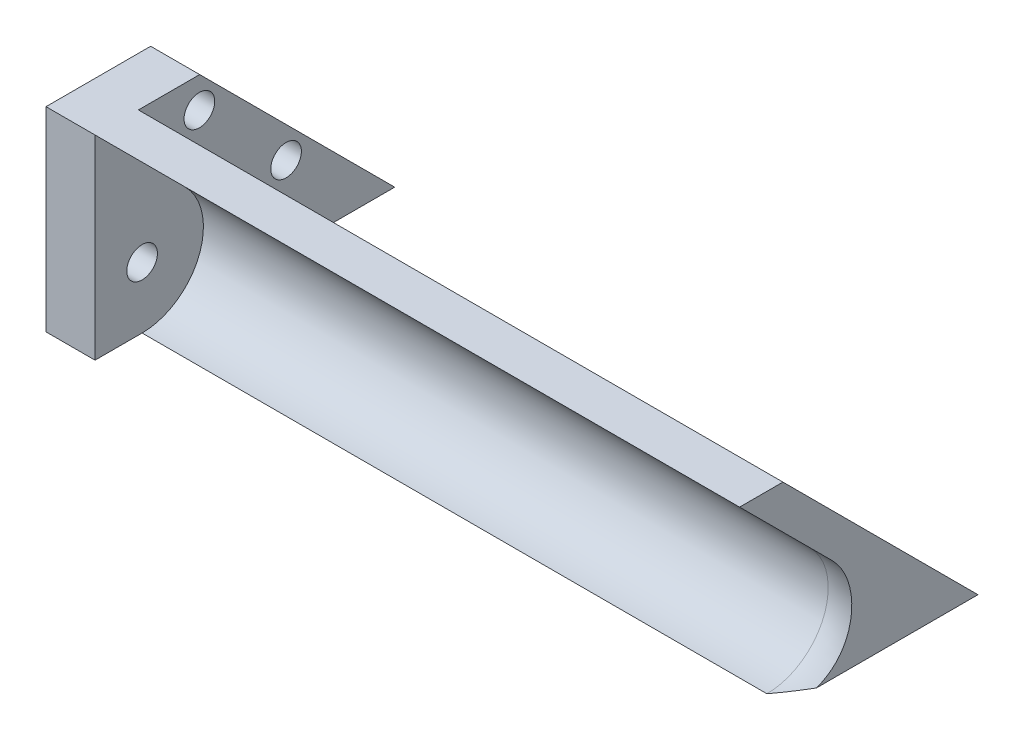
ISO-10303-21;
HEADER;
FILE_DESCRIPTION(('STEP AP214'),'2;1');
FILE_NAME('part.step','',(''),(''),'','','');
FILE_SCHEMA(('AUTOMOTIVE_DESIGN { 1 0 10303 214 1 1 1 1 }'));
ENDSEC;
DATA;
#1=APPLICATION_CONTEXT('core data for automotive mechanical design processes');
#2=APPLICATION_PROTOCOL_DEFINITION('international standard','automotive_design',2000,#1);
#3=PRODUCT_CONTEXT('',#1,'mechanical');
#4=PRODUCT('Part','Part','',(#3));
#5=PRODUCT_RELATED_PRODUCT_CATEGORY('part','',(#4));
#6=PRODUCT_DEFINITION_FORMATION('','',#4);
#7=PRODUCT_DEFINITION_CONTEXT('part definition',#1,'design');
#8=PRODUCT_DEFINITION('design','',#6,#7);
#9=PRODUCT_DEFINITION_SHAPE('','',#8);
#10=(LENGTH_UNIT() NAMED_UNIT(*) SI_UNIT(.MILLI.,.METRE.));
#11=(NAMED_UNIT(*) PLANE_ANGLE_UNIT() SI_UNIT($,.RADIAN.));
#12=(NAMED_UNIT(*) SI_UNIT($,.STERADIAN.) SOLID_ANGLE_UNIT());
#13=UNCERTAINTY_MEASURE_WITH_UNIT(LENGTH_MEASURE(1.E-05),#10,'distance_accuracy_value','');
#14=(GEOMETRIC_REPRESENTATION_CONTEXT(3) GLOBAL_UNCERTAINTY_ASSIGNED_CONTEXT((#13)) GLOBAL_UNIT_ASSIGNED_CONTEXT((#10,
#11,#12)) REPRESENTATION_CONTEXT('',''));
#15=CARTESIAN_POINT('',(0.,0.,0.));
#16=DIRECTION('',(0.,0.,1.));
#17=DIRECTION('',(1.,0.,0.));
#18=AXIS2_PLACEMENT_3D('',#15,#16,#17);
#19=CARTESIAN_POINT('',(-118.399378105604,200.019805153395,38.8908729652601));
#20=DIRECTION('',(0.,-0.707106781186546,0.707106781186549));
#21=DIRECTION('',(0.,-0.707106781186549,-0.707106781186546));
#22=AXIS2_PLACEMENT_3D('',#19,#20,#21);
#23=PLANE('',#22);
#24=DIRECTION('',(1.,0.,0.));
#25=VECTOR('',#24,1.);
#26=CARTESIAN_POINT('',(-118.399378105604,200.019805153395,38.8908729652601));
#27=LINE('',#26,#25);
#28=CARTESIAN_POINT('',(-60.15,200.019805153395,38.8908729652601));
#29=VERTEX_POINT('',#28);
#30=CARTESIAN_POINT('',(45.,200.019805153395,38.8908729652601));
#31=VERTEX_POINT('',#30);
#32=EDGE_CURVE('E188',#29,#31,#27,.T.);
#33=ORIENTED_EDGE('',*,*,#32,.F.);
#34=DIRECTION('',(0.,-0.707106781186549,-0.707106781186546));
#35=VECTOR('',#34,1.);
#36=CARTESIAN_POINT('',(-60.15,200.019805153395,38.8908729652601));
#37=LINE('',#36,#35);
#38=CARTESIAN_POINT('',(-60.15,185.271067811865,24.142135623731));
#39=VERTEX_POINT('',#38);
#40=EDGE_CURVE('E168',#29,#39,#37,.T.);
#41=ORIENTED_EDGE('',*,*,#40,.T.);
#42=DIRECTION('',(1.,0.,0.));
#43=VECTOR('',#42,1.);
#44=CARTESIAN_POINT('',(45.,185.271067811865,24.142135623731));
#45=LINE('',#44,#43);
#46=CARTESIAN_POINT('',(41.7774871346765,185.271067811865,24.142135623731));
#47=VERTEX_POINT('',#46);
#48=EDGE_CURVE('E202',#39,#47,#45,.T.);
#49=ORIENTED_EDGE('',*,*,#48,.T.);
#50=CARTESIAN_POINT('',(46.9584000407799,168.2,22.6832794280298));
#51=CARTESIAN_POINT('',(46.6003400192952,171.122809869879,19.3461661520209));
#52=CARTESIAN_POINT('',(48.9059304087847,174.794756050721,18.3419680977247));
#53=CARTESIAN_POINT('',(51.2115207982742,178.466702231563,17.3377700434285));
#54=CARTESIAN_POINT('',(54.6560593196407,180.459502259938,19.3305700718034));
#55=CARTESIAN_POINT('',(46.8009006321391,168.2,23.0093517803067));
#56=CARTESIAN_POINT('',(46.3652658331282,171.107972233382,19.5755492057038));
#57=CARTESIAN_POINT('',(48.6264725710309,174.888816342138,18.5578311504325));
#58=CARTESIAN_POINT('',(50.8862105105047,178.670178533169,17.5412463450344));
#59=CARTESIAN_POINT('',(54.3086041714141,180.759759655743,19.6308274676081));
#60=CARTESIAN_POINT('',(46.6391078828072,168.2,23.335600037787));
#61=CARTESIAN_POINT('',(46.128548693229,171.083894483979,19.7999212165271));
#62=CARTESIAN_POINT('',(48.3404313238457,174.972746948196,18.7659513791358));
#63=CARTESIAN_POINT('',(50.5507261624092,178.862005735817,17.7330735476825));
#64=CARTESIAN_POINT('',(53.9438568727814,181.050026018139,19.9210938300047));
#65=CARTESIAN_POINT('',(46.3070018430142,168.2,23.9878686284039));
#66=CARTESIAN_POINT('',(45.6543040357378,171.016456285466,20.2396947673903));
#67=CARTESIAN_POINT('',(47.7589400376996,175.118965338484,19.1657693439686));
#68=CARTESIAN_POINT('',(49.8619905613553,179.221865957463,18.092933769329));
#69=CARTESIAN_POINT('',(53.181962582888,181.608764031275,20.4798318431405));
#70=CARTESIAN_POINT('',(46.1366838912732,168.2,24.3138887358065));
#71=CARTESIAN_POINT('',(45.4167095417851,170.972970414557,20.4550996309667));
#72=CARTESIAN_POINT('',(47.4634848843515,175.181241131438,19.3574579370138));
#73=CARTESIAN_POINT('',(49.508541727137,179.389802206903,18.2608700187681));
#74=CARTESIAN_POINT('',(52.7847977903659,181.877223543693,20.7482913555588));
#75=CARTESIAN_POINT('',(45.7866958340307,168.2,24.966759248335));
#76=CARTESIAN_POINT('',(44.9431301290933,170.865395482488,20.8778789461296));
#77=CARTESIAN_POINT('',(46.8654091720954,175.282970949723,19.7243588443187));
#78=CARTESIAN_POINT('',(48.7859357807235,179.700846471078,18.5719142829436));
#79=CARTESIAN_POINT('',(51.9581098941013,182.391775271398,21.2628430832631));
#80=CARTESIAN_POINT('',(45.6069746822443,168.2,25.2936024409881));
#81=CARTESIAN_POINT('',(44.7071202213053,170.801047543408,21.0851960887905));
#82=CARTESIAN_POINT('',(46.5627557342335,175.322282355488,19.8994626509668));
#83=CARTESIAN_POINT('',(48.4165212034003,179.843683859116,18.7147516709821));
#84=CARTESIAN_POINT('',(51.5284029130281,182.637719871643,21.5087876835081));
#85=CARTESIAN_POINT('',(45.2395452240839,168.2,25.945053093347));
#86=CARTESIAN_POINT('',(44.2431526639834,170.650915694299,21.4902494064633));
#87=CARTESIAN_POINT('',(45.9570966236463,175.375987073918,20.2307572181977));
#88=CARTESIAN_POINT('',(47.669164405701,180.101223940014,18.9722917518799));
#89=CARTESIAN_POINT('',(50.6412857850037,183.103083464753,21.9741512766188));
#90=CARTESIAN_POINT('',(45.0518393371643,168.2,26.269661196154));
#91=CARTESIAN_POINT('',(44.0151655989577,170.564979946501,21.687996159522));
#92=CARTESIAN_POINT('',(45.6540910843008,175.390387880411,20.3869536535082));
#93=CARTESIAN_POINT('',(47.2910475395554,180.215802870305,19.0868706821704));
#94=CARTESIAN_POINT('',(50.1838840123151,183.32251041641,22.1935782282755));
#95=CARTESIAN_POINT('',(44.701607305926,168.2,26.8604891331435));
#96=CARTESIAN_POINT('',(43.6113144586976,170.387528643479,22.0409931897086));
#97=CARTESIAN_POINT('',(45.1050283475574,175.392627692039,20.654564097932));
#98=CARTESIAN_POINT('',(46.5973761991084,180.397733128321,19.2688009401862));
#99=CARTESIAN_POINT('',(49.3237604819523,183.697467140703,22.5685349525688));
#100=CARTESIAN_POINT('',(44.5402282112664,168.2,27.1272498896021));
#101=CARTESIAN_POINT('',(43.4330021516057,170.299250947307,22.1979195213691));
#102=CARTESIAN_POINT('',(44.8580502573194,175.384567648681,20.7690764158674));
#103=CARTESIAN_POINT('',(46.2817005028881,180.469783747997,19.3408515598621));
#104=CARTESIAN_POINT('',(48.9249696157417,183.857517188678,22.7285850005435));
#105=CARTESIAN_POINT('',(44.2129233036463,168.2,27.657493389561));
#106=CARTESIAN_POINT('',(43.0909513540868,170.107150677496,22.5054904463686));
#107=CARTESIAN_POINT('',(44.3727561488988,175.3495465646,20.9838888904452));
#108=CARTESIAN_POINT('',(45.6531581976434,180.591840947362,19.462908759228));
#109=CARTESIAN_POINT('',(48.1113636468681,184.15592241467,23.0269902265358));
#110=CARTESIAN_POINT('',(44.0469971521328,168.2,27.920975886842));
#111=CARTESIAN_POINT('',(42.9272529329444,170.003211068519,22.6561391310114));
#112=CARTESIAN_POINT('',(44.1344407787928,175.322584112795,21.0841879853863));
#113=CARTESIAN_POINT('',(45.3402242592931,180.641734183137,19.512801995003));
#114=CARTESIAN_POINT('',(47.6965473500777,184.294275972083,23.1653437839483));
#115=CARTESIAN_POINT('',(43.7117537851066,168.2,28.4429455003922));
#116=CARTESIAN_POINT('',(42.6209130209268,169.780162884959,22.9513342400472));
#117=CARTESIAN_POINT('',(43.6729128120658,175.249302599672,21.2700268463385));
#118=CARTESIAN_POINT('',(44.7235049128374,180.718218789435,19.5892866013003));
#119=CARTESIAN_POINT('',(46.8532453006996,184.546987537957,23.4180553498222));
#120=CARTESIAN_POINT('',(43.54244208825,168.2,28.7014395802963));
#121=CARTESIAN_POINT('',(42.4783226637685,169.660951297492,23.0958966309852));
#122=CARTESIAN_POINT('',(43.4496778804141,175.203012927282,21.3555887438469));
#123=CARTESIAN_POINT('',(44.4196695933358,180.744714423543,19.6157822354087));
#124=CARTESIAN_POINT('',(46.4247812108003,184.66138158428,23.5324493961454));
#125=CARTESIAN_POINT('',(43.2015542082305,168.2,29.2120226426956));
#126=CARTESIAN_POINT('',(42.2222612679956,169.408260071217,23.3799598639735));
#127=CARTESIAN_POINT('',(43.0260307650497,175.091097295973,21.5120489997605));
#128=CARTESIAN_POINT('',(43.8284396535859,180.773575020163,19.644642832029));
#129=CARTESIAN_POINT('',(45.5556439376636,184.863840673586,23.7349084854511));
#130=CARTESIAN_POINT('',(43.0299790967425,168.2,29.4641145020164));
#131=CARTESIAN_POINT('',(42.1089272738378,169.274657270325,23.5194723673247));
#132=CARTESIAN_POINT('',(42.8256081844625,175.025480194972,21.5829540502395));
#133=CARTESIAN_POINT('',(43.5410562498375,180.77579926126,19.6468670731251));
#134=CARTESIAN_POINT('',(45.1149764309876,184.951917740685,23.8229855525504));
#135=CARTESIAN_POINT('',(42.7443959962719,168.2,29.8760637520366));
#136=CARTESIAN_POINT('',(41.954300443433,169.04310534929,23.7485108647066));
#137=CARTESIAN_POINT('',(42.5204201676774,174.901332104308,21.6893614630661));
#138=CARTESIAN_POINT('',(43.0859876770944,180.759335788774,19.63040360064));
#139=CARTESIAN_POINT('',(44.3738453465578,185.073835134928,23.9449029467939));
#140=CARTESIAN_POINT('',(42.6304357920178,168.2,30.0384247647913));
#141=CARTESIAN_POINT('',(41.901572822969,168.948061313534,23.8392451109719));
#142=CARTESIAN_POINT('',(42.406154500299,174.847841029446,21.7287499444236));
#143=CARTESIAN_POINT('',(42.910250015336,180.747356454821,19.6184242666863));
#144=CARTESIAN_POINT('',(44.0760773863081,185.115953717323,23.9870215291887));
#145=CARTESIAN_POINT('',(42.4032635096129,168.2,30.3582637460014));
#146=CARTESIAN_POINT('',(41.8183882251164,168.754436280756,24.0201443977306));
#147=CARTESIAN_POINT('',(42.1967968449397,174.733866781532,21.8020372248082));
#148=CARTESIAN_POINT('',(42.5747202935793,180.713032777387,19.5841005892522));
#149=CARTESIAN_POINT('',(43.4771219675254,185.185983008251,24.0570508201165));
#150=CARTESIAN_POINT('',(42.2900515181836,168.2,30.5157411559709));
#151=CARTESIAN_POINT('',(41.78803322436,168.65582815735,24.1103162795339));
#152=CARTESIAN_POINT('',(42.1017070431072,174.673382812489,21.835935397825));
#153=CARTESIAN_POINT('',(42.4149866637422,180.690637112925,19.5617049247901));
#154=CARTESIAN_POINT('',(43.1759341232377,185.21389209738,24.0849599092457));
#155=CARTESIAN_POINT('',(42.0659426703028,168.2,30.8239380478086));
#156=CARTESIAN_POINT('',(41.7549491526265,168.457966234479,24.2910747064602));
#157=CARTESIAN_POINT('',(41.9361641478526,174.547367273482,21.8992305200102));
#158=CARTESIAN_POINT('',(42.116985850745,180.636469209467,19.5075370213325));
#159=CARTESIAN_POINT('',(42.5724659853664,185.254007427706,24.1250752395711));
#160=CARTESIAN_POINT('',(41.9550393574417,168.2,30.9746782961272));
#161=CARTESIAN_POINT('',(41.7522577444351,168.35870182482,24.3816706954864));
#162=CARTESIAN_POINT('',(41.8656300316283,174.481853191133,21.9286420889516));
#163=CARTESIAN_POINT('',(41.9787345950716,180.604680983861,19.4757487957268));
#164=CARTESIAN_POINT('',(42.2701926742582,185.266265673826,24.1373334856915));
#165=CARTESIAN_POINT('',(41.7367641736273,168.2,31.2681688577671));
#166=CARTESIAN_POINT('',(41.7805080930737,168.163276676663,24.5655404659771));
#167=CARTESIAN_POINT('',(41.7549301944878,174.348562312305,21.9849991217718));
#168=CARTESIAN_POINT('',(41.7290848312289,180.533527119537,19.4045949314029));
#169=CARTESIAN_POINT('',(41.6653243305609,185.2735635931,24.1446314049653));
#170=CARTESIAN_POINT('',(41.6293894496084,168.2,31.4109256951208));
#171=CARTESIAN_POINT('',(41.8115855984444,168.06712486398,24.6588283580545));
#172=CARTESIAN_POINT('',(41.7147393311242,174.280787437856,22.0119466110791));
#173=CARTESIAN_POINT('',(41.617789754962,180.49412971909,19.3651975309554));
#174=CARTESIAN_POINT('',(41.362729772836,185.26861754085,24.1396853527155));
#175=CARTESIAN_POINT('',(41.5174014280792,168.2,31.5583274794852));
#176=CARTESIAN_POINT('',(41.8663932752897,167.969435215037,24.7615778976564));
#177=CARTESIAN_POINT('',(41.6915800217145,174.2096043439,22.0412084096144));
#178=CARTESIAN_POINT('',(41.516766142591,180.449771747368,19.3208395592336));
#179=CARTESIAN_POINT('',(41.0396703825892,185.253062888671,24.1241307005364));
#180=CARTESIAN_POINT('',(41.509961586815,168.2,31.568112750375));
#181=CARTESIAN_POINT('',(41.8701529009245,167.962942372016,24.7684471374533));
#182=CARTESIAN_POINT('',(41.6901329086604,174.204872927965,22.0431580343027));
#183=CARTESIAN_POINT('',(41.5101123439275,180.446801752804,19.3178695646699));
#184=CARTESIAN_POINT('',(41.0181717795522,185.251978839458,24.1230466513232));
#185=CARTESIAN_POINT('',(41.502536599636,168.2,31.5778712993114));
#186=CARTESIAN_POINT('',(41.8740162765274,167.956476178094,24.7753302085133));
#187=CARTESIAN_POINT('',(41.6887814880508,174.200149176853,22.0451100979959));
#188=CARTESIAN_POINT('',(41.5035466995741,180.443822175613,19.3148899874785));
#189=CARTESIAN_POINT('',(40.9966789406514,185.250845754146,24.1219135660113));
#190=(BOUNDED_SURFACE() B_SPLINE_SURFACE(3,2,((#50,#51,#52,#53,#54),(#55,#56,#57,#58,#59),(#60,
#61,#62,#63,#64),(#65,#66,#67,#68,#69),(#70,#71,#72,#73,#74),(#75,#76,#77,#78,#79),(#80,#81,#82,
#83,#84),(#85,#86,#87,#88,#89),(#90,#91,#92,#93,#94),(#95,#96,#97,#98,#99),(#100,#101,#102,#103,
#104),(#105,#106,#107,#108,#109),(#110,#111,#112,#113,#114),(#115,#116,#117,#118,#119),(#120,
#121,#122,#123,#124),(#125,#126,#127,#128,#129),(#130,#131,#132,#133,#134),(#135,#136,#137,#138,
#139),(#140,#141,#142,#143,#144),(#145,#146,#147,#148,#149),(#150,#151,#152,#153,#154),(#155,
#156,#157,#158,#159),(#160,#161,#162,#163,#164),(#165,#166,#167,#168,#169),(#170,#171,#172,#173,
#174),(#175,#176,#177,#178,#179),(#180,#181,#182,#183,#184),(#185,#186,#187,#188,#189)),
.UNSPECIFIED.,.F.,.F.,.F.) B_SPLINE_SURFACE_WITH_KNOTS((4,2,2,2,2,2,2,2,2,2,2,2,2,4),(3,2,3),
(0.,1.64557105170536,3.29205188688368,4.94865231573501,6.60475430468366,7.97919446116451,
9.35373723170077,10.7261974441332,12.0980296230249,13.0084468284113,13.9189677674936,
14.8264552681519,15.733189996053,15.7978491405754),(0.,0.5,1.),
.UNSPECIFIED.) GEOMETRIC_REPRESENTATION_ITEM() RATIONAL_B_SPLINE_SURFACE(((1.,0.913604583546057,
1.,0.913604583546057,1.),(1.,0.911247691608365,1.,0.911247691608365,1.),(1.,0.908835662531011,
1.,0.908835662531011,1.),(1.,0.903889514076568,1.,0.903889514076568,1.),(1.,0.901355327936935,
1.,0.901355327936935,1.),(1.,0.896139653109165,1.,0.896139653109165,1.),(1.,0.893457354801431,
1.,0.893457354801431,1.),(1.,0.887948064320098,1.,0.887948064320098,1.),(1.,0.885121115924989,
1.,0.885121115924989,1.),(1.,0.879803663965609,1.,0.879803663965609,1.),(1.,0.87733771056666,1.,
0.87733771056666,1.),(1.,0.87228923423538,1.,0.87228923423538,1.),(1.,0.869706702613852,1.,
0.869706702613852,1.),(1.,0.864423761837703,1.,0.864423761837703,1.),(1.,0.86172353720654,1.,
0.86172353720654,1.),(1.,0.856200274129712,1.,0.856200274129712,1.),(1.,0.85337729244868,1.,
0.85337729244868,1.),(1.,0.848585173061255,1.,0.848585173061255,1.),(1.,0.846648211990795,1.,
0.846648211990795,1.),(1.,0.842729193534773,1.,0.842729193534773,1.),(1.,0.840747131036045,1.,
0.840747131036045,1.),(1.,0.83675717385711,1.,0.83675717385711,1.),(1.,0.834749387237139,1.,
0.834749387237139,1.),(1.,0.830723446794037,1.,0.830723446794037,1.),(1.,0.828705302952179,1.,
0.828705302952179,1.),(1.,0.826557453221529,1.,0.826557453221529,1.),(1.,0.826414552776419,1.,
0.826414552776419,1.),(1.,0.82627172675782,1.,0.82627172675782,1.))) REPRESENTATION_ITEM('') SURFACE());
#191=CARTESIAN_POINT('',(40.9966789406514,185.250845754146,24.1219135660113));
#192=CARTESIAN_POINT('',(41.0181717795522,185.251978839458,24.1230466513232));
#193=CARTESIAN_POINT('',(41.0396703825892,185.253062888671,24.1241307005364));
#194=CARTESIAN_POINT('',(41.362729772836,185.26861754085,24.1396853527155));
#195=CARTESIAN_POINT('',(41.6653243305609,185.2735635931,24.1446314049653));
#196=CARTESIAN_POINT('',(42.2701926742581,185.266265673826,24.1373334856915));
#197=CARTESIAN_POINT('',(42.5724659853664,185.254007427706,24.1250752395711));
#198=CARTESIAN_POINT('',(43.1759341232377,185.21389209738,24.0849599092457));
#199=CARTESIAN_POINT('',(43.4771219675254,185.185983008251,24.0570508201165));
#200=CARTESIAN_POINT('',(44.0760773863081,185.115953717323,23.9870215291887));
#201=CARTESIAN_POINT('',(44.3738453465578,185.073835134928,23.9449029467939));
#202=CARTESIAN_POINT('',(45.1149764309876,184.951917740685,23.8229855525504));
#203=CARTESIAN_POINT('',(45.5556439376636,184.863840673586,23.7349084854511));
#204=CARTESIAN_POINT('',(46.4247812108003,184.66138158428,23.5324493961454));
#205=CARTESIAN_POINT('',(46.8532453006996,184.546987537957,23.4180553498222));
#206=CARTESIAN_POINT('',(47.6965473500777,184.294275972083,23.1653437839483));
#207=CARTESIAN_POINT('',(48.1113636468681,184.15592241467,23.0269902265358));
#208=CARTESIAN_POINT('',(48.9249696157417,183.857517188678,22.7285850005435));
#209=CARTESIAN_POINT('',(49.3237604819523,183.697467140703,22.5685349525688));
#210=CARTESIAN_POINT('',(50.1838840123151,183.32251041641,22.1935782282755));
#211=CARTESIAN_POINT('',(50.6412857850037,183.103083464753,21.9741512766188));
#212=CARTESIAN_POINT('',(51.5284029130281,182.637719871643,21.5087876835081));
#213=CARTESIAN_POINT('',(51.9581098941013,182.391775271398,21.2628430832631));
#214=CARTESIAN_POINT('',(52.784797790366,181.877223543693,20.7482913555588));
#215=CARTESIAN_POINT('',(53.181962582888,181.608764031275,20.4798318431405));
#216=CARTESIAN_POINT('',(53.9438568727814,181.050026018139,19.9210938300047));
#217=CARTESIAN_POINT('',(54.3086041714141,180.759759655743,19.6308274676081));
#218=CARTESIAN_POINT('',(54.6560593196407,180.459502259938,19.3305700718034));
#219=B_SPLINE_CURVE_WITH_KNOTS('',3,(#191,#192,#193,#194,#195,#196,#197,#198,#199,#200,#201,
#202,#203,#204,#205,#206,#207,#208,#209,#210,#211,#212,#213,#214,#215,#216,#217,#218),
.UNSPECIFIED.,.F.,.F.,(4,2,2,2,2,2,2,2,2,2,2,2,2,4),(0.,0.0646591445224234,0.971393872423466,
1.87888137308179,2.7894023121641,3.69981951755048,5.07165169644218,6.44411190887462,
7.81865467941088,9.19309483589173,10.8491968248404,12.5057972536917,14.15227808887,
15.7978491405754),.UNSPECIFIED.);
#220=CARTESIAN_POINT('',(45.,184.967974263116,23.8390420749815));
#221=VERTEX_POINT('',#220);
#222=EDGE_CURVE('E195',#47,#221,#219,.T.);
#223=ORIENTED_EDGE('',*,*,#222,.T.);
#224=DIRECTION('',(0.,-0.707106781186549,-0.707106781186546));
#225=VECTOR('',#224,1.);
#226=CARTESIAN_POINT('',(45.,200.019805153395,38.8908729652601));
#227=LINE('',#226,#225);
#228=EDGE_CURVE('E174',#31,#221,#227,.T.);
#229=ORIENTED_EDGE('',*,*,#228,.F.);
#230=EDGE_LOOP('',(#33,#41,#49,#223,#229));
#231=FACE_BOUND('',#230,.T.);
#232=ADVANCED_FACE('F37',(#231),#23,.T.);
#233=CARTESIAN_POINT('',(-118.399378105604,178.2,31.2132034355965));
#234=DIRECTION('',(-1.,0.,0.));
#235=DIRECTION('',(0.,0.,1.));
#236=AXIS2_PLACEMENT_3D('',#233,#234,#235);
#237=CYLINDRICAL_SURFACE('',#236,10.);
#238=CARTESIAN_POINT('',(-60.15,178.2,31.2132034355965));
#239=DIRECTION('',(-1.,0.,0.));
#240=DIRECTION('',(0.,0.,1.));
#241=AXIS2_PLACEMENT_3D('',#238,#239,#240);
#242=CIRCLE('',#241,10.);
#243=CARTESIAN_POINT('',(-60.15,168.2,31.2132034355965));
#244=VERTEX_POINT('',#243);
#245=EDGE_CURVE('E166',#244,#39,#242,.F.);
#246=ORIENTED_EDGE('',*,*,#245,.F.);
#247=DIRECTION('',(1.,0.,0.));
#248=VECTOR('',#247,1.);
#249=CARTESIAN_POINT('',(-68.15,168.2,31.2132034355965));
#250=LINE('',#249,#248);
#251=CARTESIAN_POINT('',(41.7774871346765,168.2,31.2132034355965));
#252=VERTEX_POINT('',#251);
#253=EDGE_CURVE('E54',#252,#244,#250,.F.);
#254=ORIENTED_EDGE('',*,*,#253,.F.);
#255=CARTESIAN_POINT('',(41.7774871346765,178.2,31.2132034355965));
#256=DIRECTION('',(1.,0.,0.));
#257=DIRECTION('',(0.,0.,-1.));
#258=AXIS2_PLACEMENT_3D('',#255,#256,#257);
#259=CIRCLE('',#258,10.);
#260=EDGE_CURVE('E173',#252,#47,#259,.T.);
#261=ORIENTED_EDGE('',*,*,#260,.T.);
#262=ORIENTED_EDGE('',*,*,#48,.F.);
#263=EDGE_LOOP('',(#246,#254,#261,#262));
#264=FACE_BOUND('',#263,.T.);
#265=ADVANCED_FACE('F211',(#264),#237,.F.);
#266=CARTESIAN_POINT('',(-68.15,-117.643013384419,0.));
#267=DIRECTION('',(-1.,0.,0.));
#268=DIRECTION('',(0.,0.,1.));
#269=AXIS2_PLACEMENT_3D('',#266,#267,#268);
#270=PLANE('',#269);
#271=CARTESIAN_POINT('',(-68.15,178.2,31.2132034355965));
#272=DIRECTION('',(1.,0.,0.));
#273=DIRECTION('',(0.,0.,-1.));
#274=AXIS2_PLACEMENT_3D('',#271,#272,#273);
#275=CIRCLE('',#274,2.5);
#276=CARTESIAN_POINT('',(-68.15,178.2,28.7132034355965));
#277=VERTEX_POINT('',#276);
#278=EDGE_CURVE('E146',#277,#277,#275,.T.);
#279=ORIENTED_EDGE('',*,*,#278,.T.);
#280=EDGE_LOOP('',(#279));
#281=FACE_BOUND('',#280,.T.);
#282=CARTESIAN_POINT('',(-68.15,195.019805153395,21.8700576850888));
#283=DIRECTION('',(1.,0.,0.));
#284=DIRECTION('',(0.,0.,-1.));
#285=AXIS2_PLACEMENT_3D('',#282,#283,#284);
#286=CIRCLE('',#285,2.5);
#287=CARTESIAN_POINT('',(-68.15,195.019805153395,19.3700576850888));
#288=VERTEX_POINT('',#287);
#289=EDGE_CURVE('E373',#288,#288,#286,.T.);
#290=ORIENTED_EDGE('',*,*,#289,.T.);
#291=EDGE_LOOP('',(#290));
#292=FACE_BOUND('',#291,.T.);
#293=CARTESIAN_POINT('',(-68.15,180.877669529664,7.72792206135767));
#294=DIRECTION('',(1.,0.,0.));
#295=DIRECTION('',(0.,0.,-1.));
#296=AXIS2_PLACEMENT_3D('',#293,#294,#295);
#297=CIRCLE('',#296,2.5);
#298=CARTESIAN_POINT('',(-68.15,180.877669529664,5.22792206135767));
#299=VERTEX_POINT('',#298);
#300=EDGE_CURVE('E381',#299,#299,#297,.T.);
#301=ORIENTED_EDGE('',*,*,#300,.T.);
#302=EDGE_LOOP('',(#301));
#303=FACE_BOUND('',#302,.T.);
#304=DIRECTION('',(0.,0.,-1.));
#305=VECTOR('',#304,1.);
#306=CARTESIAN_POINT('',(-68.15,168.2,-70.));
#307=LINE('',#306,#305);
#308=CARTESIAN_POINT('',(-68.15,168.2,38.8908729652601));
#309=VERTEX_POINT('',#308);
#310=CARTESIAN_POINT('',(-68.15,168.2,-10.));
#311=VERTEX_POINT('',#310);
#312=EDGE_CURVE('E171',#309,#311,#307,.T.);
#313=ORIENTED_EDGE('',*,*,#312,.F.);
#314=DIRECTION('',(0.,1.,0.));
#315=VECTOR('',#314,1.);
#316=CARTESIAN_POINT('',(-68.15,200.019805153395,38.8908729652601));
#317=LINE('',#316,#315);
#318=CARTESIAN_POINT('',(-68.15,200.019805153395,38.8908729652601));
#319=VERTEX_POINT('',#318);
#320=EDGE_CURVE('E154',#309,#319,#317,.T.);
#321=ORIENTED_EDGE('',*,*,#320,.T.);
#322=DIRECTION('',(0.,0.,1.));
#323=VECTOR('',#322,1.);
#324=CARTESIAN_POINT('',(-68.15,200.019805153395,38.8908729652601));
#325=LINE('',#324,#323);
#326=CARTESIAN_POINT('',(-68.15,200.019805153395,21.8198051533946));
#327=VERTEX_POINT('',#326);
#328=EDGE_CURVE('E186',#327,#319,#325,.T.);
#329=ORIENTED_EDGE('',*,*,#328,.F.);
#330=DIRECTION('',(0.,-0.707106781186548,-0.707106781186547));
#331=VECTOR('',#330,1.);
#332=CARTESIAN_POINT('',(-68.15,168.2,-10.));
#333=LINE('',#332,#331);
#334=EDGE_CURVE('E130',#327,#311,#333,.T.);
#335=ORIENTED_EDGE('',*,*,#334,.T.);
#336=EDGE_LOOP('',(#313,#321,#329,#335));
#337=FACE_BOUND('',#336,.T.);
#338=ADVANCED_FACE('F223',(#281,#292,#303,#337),#270,.T.);
#339=CARTESIAN_POINT('',(45.,0.,0.));
#340=DIRECTION('',(1.,0.,0.));
#341=DIRECTION('',(0.,0.,-1.));
#342=AXIS2_PLACEMENT_3D('',#339,#340,#341);
#343=PLANE('',#342);
#344=DIRECTION('',(0.,0.,-1.));
#345=VECTOR('',#344,1.);
#346=CARTESIAN_POINT('',(45.,168.2,7.07106781186561));
#347=LINE('',#346,#345);
#348=CARTESIAN_POINT('',(45.,168.2,26.3556919848444));
#349=VERTEX_POINT('',#348);
#350=CARTESIAN_POINT('',(45.,168.2,0.));
#351=VERTEX_POINT('',#350);
#352=EDGE_CURVE('E183',#349,#351,#347,.T.);
#353=ORIENTED_EDGE('',*,*,#352,.T.);
#354=DIRECTION('',(0.,0.707106781186548,0.707106781186547));
#355=VECTOR('',#354,1.);
#356=CARTESIAN_POINT('',(45.,168.2,0.));
#357=LINE('',#356,#355);
#358=CARTESIAN_POINT('',(45.,200.019805153395,31.8198051533946));
#359=VERTEX_POINT('',#358);
#360=EDGE_CURVE('E180',#351,#359,#357,.T.);
#361=ORIENTED_EDGE('',*,*,#360,.T.);
#362=DIRECTION('',(0.,0.,1.));
#363=VECTOR('',#362,1.);
#364=CARTESIAN_POINT('',(45.,200.019805153395,38.8908729652601));
#365=LINE('',#364,#363);
#366=EDGE_CURVE('E177',#359,#31,#365,.T.);
#367=ORIENTED_EDGE('',*,*,#366,.T.);
#368=ORIENTED_EDGE('',*,*,#228,.T.);
#369=CARTESIAN_POINT('',(45.,184.967974263116,23.8390420749815));
#370=CARTESIAN_POINT('',(45.,184.747719788331,23.6187326768368));
#371=CARTESIAN_POINT('',(45.,184.517783893204,23.4081599758656));
#372=CARTESIAN_POINT('',(45.,184.040664141024,23.0077175870314));
#373=CARTESIAN_POINT('',(45.,183.793486064236,22.8178410151867));
#374=CARTESIAN_POINT('',(45.,183.284578557842,22.4603856926886));
#375=CARTESIAN_POINT('',(45.,183.022892932167,22.2927445038898));
#376=CARTESIAN_POINT('',(45.,182.486382567834,21.9799805649355));
#377=CARTESIAN_POINT('',(45.,182.211557003494,21.8348592323122));
#378=CARTESIAN_POINT('',(45.,181.651204853638,21.5679999240726));
#379=CARTESIAN_POINT('',(45.,181.36569186053,21.4462333774017));
#380=CARTESIAN_POINT('',(45.,180.785571566263,21.2263209467126));
#381=CARTESIAN_POINT('',(45.,180.490960231155,21.128185714843));
#382=CARTESIAN_POINT('',(45.,179.894566452549,20.9559317286942));
#383=CARTESIAN_POINT('',(45.,179.592778847884,20.8818308573105));
#384=CARTESIAN_POINT('',(45.,178.98423144777,20.7580681452991));
#385=CARTESIAN_POINT('',(45.,178.677471533368,20.7084068902476));
#386=CARTESIAN_POINT('',(45.,178.048309035296,20.6323123383596));
#387=CARTESIAN_POINT('',(45.,177.725780626389,20.6069144686326));
#388=CARTESIAN_POINT('',(45.,177.079689192141,20.5833708828694));
#389=CARTESIAN_POINT('',(45.,176.75612606806,20.5852278502783));
#390=CARTESIAN_POINT('',(45.,176.110397395245,20.6167686057668));
#391=CARTESIAN_POINT('',(45.,175.788231618605,20.6464476703524));
#392=CARTESIAN_POINT('',(45.,175.147836901666,20.7343683271049));
#393=CARTESIAN_POINT('',(45.,174.829607068264,20.7926033130708));
#394=CARTESIAN_POINT('',(45.,174.262604997465,20.9240203607742));
#395=CARTESIAN_POINT('',(45.,174.012603153454,20.9919283037585));
#396=CARTESIAN_POINT('',(45.,173.518709996729,21.1471400100438));
#397=CARTESIAN_POINT('',(45.,173.27481744244,21.2344397962182));
#398=CARTESIAN_POINT('',(45.,172.795460950032,21.428698562086));
#399=CARTESIAN_POINT('',(45.,172.559982965848,21.5356227577253));
#400=CARTESIAN_POINT('',(45.,172.099138737364,21.7694672212724));
#401=CARTESIAN_POINT('',(45.,171.873772455594,21.8963874150775));
#402=CARTESIAN_POINT('',(45.,171.433936797709,22.1710615090865));
#403=CARTESIAN_POINT('',(45.,171.219552237709,22.3189516149019));
#404=CARTESIAN_POINT('',(45.,170.805655145226,22.6342915036928));
#405=CARTESIAN_POINT('',(45.,170.606142797967,22.8017415302061));
#406=CARTESIAN_POINT('',(45.,170.223845368784,23.1552295868497));
#407=CARTESIAN_POINT('',(45.,170.041082151925,23.3412912693395));
#408=CARTESIAN_POINT('',(45.,169.694253024085,23.7300469965311));
#409=CARTESIAN_POINT('',(45.,169.530184044352,23.9327383019737));
#410=CARTESIAN_POINT('',(45.,169.251836325915,24.311715052861));
#411=CARTESIAN_POINT('',(45.,169.134081054265,24.485465219542));
#412=CARTESIAN_POINT('',(45.,168.911659515842,24.8411453429195));
#413=CARTESIAN_POINT('',(45.,168.806992914232,25.0230750902027));
#414=CARTESIAN_POINT('',(45.,168.611021421675,25.3935508926575));
#415=CARTESIAN_POINT('',(45.,168.519692835983,25.5820844586609));
#416=CARTESIAN_POINT('',(45.,168.350093025663,25.9648716630368));
#417=CARTESIAN_POINT('',(45.,168.271817696934,26.1591234808363));
#418=CARTESIAN_POINT('',(45.,168.2,26.3556919848444));
#419=B_SPLINE_CURVE_WITH_KNOTS('',3,(#369,#370,#371,#372,#373,#374,#375,#376,#377,#378,#379,
#380,#381,#382,#383,#384,#385,#386,#387,#388,#389,#390,#391,#392,#393,#394,#395,#396,#397,#398,
#399,#400,#401,#402,#403,#404,#405,#406,#407,#408,#409,#410,#411,#412,#413,#414,#415,#416,#417,
#418),.UNSPECIFIED.,.F.,.F.,(4,2,2,2,2,2,2,2,2,2,2,2,2,2,2,2,2,2,2,2,2,2,2,2,4),(0.,
0.934219067960077,1.8681264399576,2.79935317224415,3.73063849766813,4.66077716602947,
5.5913343259484,6.52258229201445,7.45385256981225,8.42329129237233,9.3928254641552,
10.3621950631688,11.3313405114309,12.1077916223877,12.8840836356313,13.6590127398918,
14.4339389724327,15.2141511388426,15.9943730205992,16.7755993469044,17.556697245678,
18.1858216319647,18.8149299206013,19.4429066482643,20.0706855586368),.UNSPECIFIED.);
#420=EDGE_CURVE('E11',#221,#349,#419,.T.);
#421=ORIENTED_EDGE('',*,*,#420,.T.);
#422=EDGE_LOOP('',(#353,#361,#367,#368,#421));
#423=FACE_BOUND('',#422,.T.);
#424=ADVANCED_FACE('F213',(#423),#343,.T.);
#425=CARTESIAN_POINT('',(-118.399378105604,168.2,0.));
#426=DIRECTION('',(0.,0.707106781186547,-0.707106781186548));
#427=DIRECTION('',(0.,0.707106781186548,0.707106781186547));
#428=AXIS2_PLACEMENT_3D('',#425,#426,#427);
#429=PLANE('',#428);
#430=DIRECTION('',(0.,0.707106781186548,0.707106781186547));
#431=VECTOR('',#430,1.);
#432=CARTESIAN_POINT('',(-60.15,200.019805153395,31.8198051533946));
#433=LINE('',#432,#431);
#434=CARTESIAN_POINT('',(-60.15,168.2,0.));
#435=VERTEX_POINT('',#434);
#436=CARTESIAN_POINT('',(-60.15,200.019805153395,31.8198051533946));
#437=VERTEX_POINT('',#436);
#438=EDGE_CURVE('E62',#435,#437,#433,.T.);
#439=ORIENTED_EDGE('',*,*,#438,.T.);
#440=DIRECTION('',(1.,0.,0.));
#441=VECTOR('',#440,1.);
#442=CARTESIAN_POINT('',(-118.399378105604,200.019805153395,31.8198051533946));
#443=LINE('',#442,#441);
#444=EDGE_CURVE('E144',#437,#359,#443,.T.);
#445=ORIENTED_EDGE('',*,*,#444,.T.);
#446=ORIENTED_EDGE('',*,*,#360,.F.);
#447=DIRECTION('',(1.,0.,0.));
#448=VECTOR('',#447,1.);
#449=CARTESIAN_POINT('',(-118.399378105604,168.2,0.));
#450=LINE('',#449,#448);
#451=EDGE_CURVE('E191',#435,#351,#450,.T.);
#452=ORIENTED_EDGE('',*,*,#451,.F.);
#453=EDGE_LOOP('',(#439,#445,#446,#452));
#454=FACE_BOUND('',#453,.T.);
#455=ADVANCED_FACE('F219',(#454),#429,.T.);
#456=CARTESIAN_POINT('',(-118.399378105604,200.019805153395,38.8908729652601));
#457=DIRECTION('',(0.,1.,0.));
#458=DIRECTION('',(0.,0.,1.));
#459=AXIS2_PLACEMENT_3D('',#456,#457,#458);
#460=PLANE('',#459);
#461=EDGE_CURVE('E189',#319,#29,#27,.T.);
#462=ORIENTED_EDGE('',*,*,#461,.T.);
#463=ORIENTED_EDGE('',*,*,#32,.T.);
#464=ORIENTED_EDGE('',*,*,#366,.F.);
#465=ORIENTED_EDGE('',*,*,#444,.F.);
#466=DIRECTION('',(0.,0.,-1.));
#467=VECTOR('',#466,1.);
#468=CARTESIAN_POINT('',(-60.15,200.019805153395,31.8198051533946));
#469=LINE('',#468,#467);
#470=CARTESIAN_POINT('',(-60.15,200.019805153395,21.8198051533946));
#471=VERTEX_POINT('',#470);
#472=EDGE_CURVE('E137',#437,#471,#469,.T.);
#473=ORIENTED_EDGE('',*,*,#472,.T.);
#474=DIRECTION('',(-1.,0.,0.));
#475=VECTOR('',#474,1.);
#476=CARTESIAN_POINT('',(-60.15,200.019805153395,21.8198051533946));
#477=LINE('',#476,#475);
#478=EDGE_CURVE('E124',#471,#327,#477,.T.);
#479=ORIENTED_EDGE('',*,*,#478,.T.);
#480=ORIENTED_EDGE('',*,*,#328,.T.);
#481=EDGE_LOOP('',(#462,#463,#464,#465,#473,#479,#480));
#482=FACE_BOUND('',#481,.T.);
#483=ADVANCED_FACE('F142',(#482),#460,.T.);
#484=ORIENTED_EDGE('',*,*,#420,.F.);
#485=ORIENTED_EDGE('',*,*,#222,.F.);
#486=ORIENTED_EDGE('',*,*,#260,.F.);
#487=CARTESIAN_POINT('',(0.,168.2,0.));
#488=DIRECTION('',(0.,1.,0.));
#489=DIRECTION('',(0.,0.,1.));
#490=AXIS2_PLACEMENT_3D('',#487,#488,#489);
#491=CIRCLE('',#490,52.1499999999999);
#492=EDGE_CURVE('E70',#252,#349,#491,.T.);
#493=ORIENTED_EDGE('',*,*,#492,.T.);
#494=EDGE_LOOP('',(#484,#485,#486,#493));
#495=FACE_BOUND('',#494,.T.);
#496=ADVANCED_FACE('F39',(#495),#190,.F.);
#497=CARTESIAN_POINT('',(127.85,168.2,-70.));
#498=DIRECTION('',(0.,1.,0.));
#499=DIRECTION('',(0.,0.,1.));
#500=AXIS2_PLACEMENT_3D('',#497,#498,#499);
#501=PLANE('',#500);
#502=ORIENTED_EDGE('',*,*,#312,.T.);
#503=DIRECTION('',(-1.,0.,0.));
#504=VECTOR('',#503,1.);
#505=CARTESIAN_POINT('',(-60.15,168.2,-10.));
#506=LINE('',#505,#504);
#507=CARTESIAN_POINT('',(-60.15,168.2,-10.));
#508=VERTEX_POINT('',#507);
#509=EDGE_CURVE('E134',#508,#311,#506,.T.);
#510=ORIENTED_EDGE('',*,*,#509,.F.);
#511=DIRECTION('',(0.,0.,1.));
#512=VECTOR('',#511,1.);
#513=CARTESIAN_POINT('',(-60.15,168.2,0.));
#514=LINE('',#513,#512);
#515=EDGE_CURVE('E138',#508,#435,#514,.T.);
#516=ORIENTED_EDGE('',*,*,#515,.T.);
#517=ORIENTED_EDGE('',*,*,#451,.T.);
#518=ORIENTED_EDGE('',*,*,#352,.F.);
#519=ORIENTED_EDGE('',*,*,#492,.F.);
#520=ORIENTED_EDGE('',*,*,#253,.T.);
#521=DIRECTION('',(0.,0.,1.));
#522=VECTOR('',#521,1.);
#523=CARTESIAN_POINT('',(-60.15,168.2,0.));
#524=LINE('',#523,#522);
#525=CARTESIAN_POINT('',(-60.15,168.2,38.8908729652601));
#526=VERTEX_POINT('',#525);
#527=EDGE_CURVE('E156',#244,#526,#524,.T.);
#528=ORIENTED_EDGE('',*,*,#527,.T.);
#529=DIRECTION('',(-1.,0.,0.));
#530=VECTOR('',#529,1.);
#531=CARTESIAN_POINT('',(-60.15,168.2,38.8908729652601));
#532=LINE('',#531,#530);
#533=EDGE_CURVE('E161',#526,#309,#532,.T.);
#534=ORIENTED_EDGE('',*,*,#533,.T.);
#535=EDGE_LOOP('',(#502,#510,#516,#517,#518,#519,#520,#528,#534));
#536=FACE_BOUND('',#535,.T.);
#537=ADVANCED_FACE('F254',(#536),#501,.F.);
#538=CARTESIAN_POINT('',(-60.15,200.019805153395,38.8908729652601));
#539=DIRECTION('',(0.,0.,1.));
#540=DIRECTION('',(1.,0.,0.));
#541=AXIS2_PLACEMENT_3D('',#538,#539,#540);
#542=PLANE('',#541);
#543=ORIENTED_EDGE('',*,*,#320,.F.);
#544=ORIENTED_EDGE('',*,*,#533,.F.);
#545=DIRECTION('',(0.,1.,0.));
#546=VECTOR('',#545,1.);
#547=CARTESIAN_POINT('',(-60.15,200.019805153395,38.8908729652601));
#548=LINE('',#547,#546);
#549=EDGE_CURVE('E158',#526,#29,#548,.T.);
#550=ORIENTED_EDGE('',*,*,#549,.T.);
#551=ORIENTED_EDGE('',*,*,#461,.F.);
#552=EDGE_LOOP('',(#543,#544,#550,#551));
#553=FACE_BOUND('',#552,.T.);
#554=ADVANCED_FACE('F250',(#553),#542,.T.);
#555=CARTESIAN_POINT('',(-60.15,0.,0.));
#556=DIRECTION('',(-1.,0.,0.));
#557=DIRECTION('',(0.,0.,1.));
#558=AXIS2_PLACEMENT_3D('',#555,#556,#557);
#559=PLANE('',#558);
#560=CARTESIAN_POINT('',(-60.15,178.2,31.2132034355965));
#561=DIRECTION('',(1.,0.,0.));
#562=DIRECTION('',(0.,0.,-1.));
#563=AXIS2_PLACEMENT_3D('',#560,#561,#562);
#564=CIRCLE('',#563,2.5);
#565=CARTESIAN_POINT('',(-60.15,178.2,28.7132034355965));
#566=VERTEX_POINT('',#565);
#567=EDGE_CURVE('E372',#566,#566,#564,.T.);
#568=ORIENTED_EDGE('',*,*,#567,.F.);
#569=EDGE_LOOP('',(#568));
#570=FACE_BOUND('',#569,.T.);
#571=ORIENTED_EDGE('',*,*,#40,.F.);
#572=ORIENTED_EDGE('',*,*,#549,.F.);
#573=ORIENTED_EDGE('',*,*,#527,.F.);
#574=ORIENTED_EDGE('',*,*,#245,.T.);
#575=EDGE_LOOP('',(#571,#572,#573,#574));
#576=FACE_BOUND('',#575,.T.);
#577=ADVANCED_FACE('F256',(#570,#576),#559,.F.);
#578=CARTESIAN_POINT('',(-60.15,168.2,-10.));
#579=DIRECTION('',(0.,0.707106781186547,-0.707106781186548));
#580=DIRECTION('',(0.,0.707106781186548,0.707106781186547));
#581=AXIS2_PLACEMENT_3D('',#578,#579,#580);
#582=PLANE('',#581);
#583=ORIENTED_EDGE('',*,*,#334,.F.);
#584=ORIENTED_EDGE('',*,*,#478,.F.);
#585=DIRECTION('',(0.,-0.707106781186548,-0.707106781186547));
#586=VECTOR('',#585,1.);
#587=CARTESIAN_POINT('',(-60.15,168.2,-10.));
#588=LINE('',#587,#586);
#589=EDGE_CURVE('E128',#471,#508,#588,.T.);
#590=ORIENTED_EDGE('',*,*,#589,.T.);
#591=ORIENTED_EDGE('',*,*,#509,.T.);
#592=EDGE_LOOP('',(#583,#584,#590,#591));
#593=FACE_BOUND('',#592,.T.);
#594=ADVANCED_FACE('F126',(#593),#582,.T.);
#595=CARTESIAN_POINT('',(-60.15,0.,0.));
#596=DIRECTION('',(1.,0.,0.));
#597=DIRECTION('',(0.,0.,-1.));
#598=AXIS2_PLACEMENT_3D('',#595,#596,#597);
#599=PLANE('',#598);
#600=CARTESIAN_POINT('',(-60.15,195.019805153395,21.8700576850888));
#601=DIRECTION('',(1.,0.,0.));
#602=DIRECTION('',(0.,0.,-1.));
#603=AXIS2_PLACEMENT_3D('',#600,#601,#602);
#604=CIRCLE('',#603,2.5);
#605=CARTESIAN_POINT('',(-60.15,195.019805153395,19.3700576850888));
#606=VERTEX_POINT('',#605);
#607=EDGE_CURVE('E377',#606,#606,#604,.T.);
#608=ORIENTED_EDGE('',*,*,#607,.F.);
#609=EDGE_LOOP('',(#608));
#610=FACE_BOUND('',#609,.T.);
#611=CARTESIAN_POINT('',(-60.15,180.877669529664,7.72792206135767));
#612=DIRECTION('',(1.,0.,0.));
#613=DIRECTION('',(0.,0.,-1.));
#614=AXIS2_PLACEMENT_3D('',#611,#612,#613);
#615=CIRCLE('',#614,2.5);
#616=CARTESIAN_POINT('',(-60.15,180.877669529664,5.22792206135767));
#617=VERTEX_POINT('',#616);
#618=EDGE_CURVE('E149',#617,#617,#615,.T.);
#619=ORIENTED_EDGE('',*,*,#618,.F.);
#620=EDGE_LOOP('',(#619));
#621=FACE_BOUND('',#620,.T.);
#622=ORIENTED_EDGE('',*,*,#472,.F.);
#623=ORIENTED_EDGE('',*,*,#438,.F.);
#624=ORIENTED_EDGE('',*,*,#515,.F.);
#625=ORIENTED_EDGE('',*,*,#589,.F.);
#626=EDGE_LOOP('',(#622,#623,#624,#625));
#627=FACE_BOUND('',#626,.T.);
#628=ADVANCED_FACE('F136',(#610,#621,#627),#599,.T.);
#629=CARTESIAN_POINT('',(-68.15,180.877669529664,7.72792206135767));
#630=DIRECTION('',(1.,0.,0.));
#631=DIRECTION('',(0.,0.,-1.));
#632=AXIS2_PLACEMENT_3D('',#629,#630,#631);
#633=CYLINDRICAL_SURFACE('',#632,2.5);
#634=ORIENTED_EDGE('',*,*,#300,.F.);
#635=EDGE_LOOP('',(#634));
#636=FACE_BOUND('',#635,.T.);
#637=ORIENTED_EDGE('',*,*,#618,.T.);
#638=EDGE_LOOP('',(#637));
#639=FACE_BOUND('',#638,.T.);
#640=ADVANCED_FACE('F335',(#636,#639),#633,.F.);
#641=CARTESIAN_POINT('',(-68.15,195.019805153395,21.8700576850888));
#642=DIRECTION('',(1.,0.,0.));
#643=DIRECTION('',(0.,0.,-1.));
#644=AXIS2_PLACEMENT_3D('',#641,#642,#643);
#645=CYLINDRICAL_SURFACE('',#644,2.5);
#646=ORIENTED_EDGE('',*,*,#289,.F.);
#647=EDGE_LOOP('',(#646));
#648=FACE_BOUND('',#647,.T.);
#649=ORIENTED_EDGE('',*,*,#607,.T.);
#650=EDGE_LOOP('',(#649));
#651=FACE_BOUND('',#650,.T.);
#652=ADVANCED_FACE('F344',(#648,#651),#645,.F.);
#653=CARTESIAN_POINT('',(-68.15,178.2,31.2132034355965));
#654=DIRECTION('',(1.,0.,0.));
#655=DIRECTION('',(0.,0.,-1.));
#656=AXIS2_PLACEMENT_3D('',#653,#654,#655);
#657=CYLINDRICAL_SURFACE('',#656,2.5);
#658=ORIENTED_EDGE('',*,*,#278,.F.);
#659=EDGE_LOOP('',(#658));
#660=FACE_BOUND('',#659,.T.);
#661=ORIENTED_EDGE('',*,*,#567,.T.);
#662=EDGE_LOOP('',(#661));
#663=FACE_BOUND('',#662,.T.);
#664=ADVANCED_FACE('F354',(#660,#663),#657,.F.);
#665=CLOSED_SHELL('',(#232,#265,#338,#424,#455,#483,#496,#537,#554,#577,#594,#628,#640,#652,#664));
#666=MANIFOLD_SOLID_BREP('B2',#665);
#667=ADVANCED_BREP_SHAPE_REPRESENTATION('',(#18,#666),#14);
#668=SHAPE_DEFINITION_REPRESENTATION(#9,#667);
ENDSEC;
END-ISO-10303-21;
